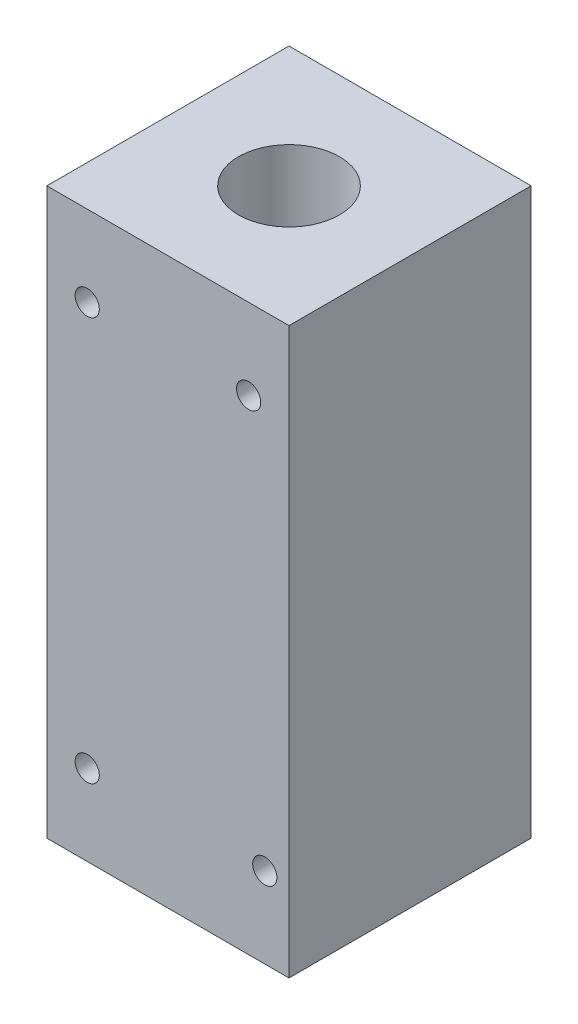
ISO-10303-21;
HEADER;
FILE_DESCRIPTION(('STEP AP214'),'2;1');
FILE_NAME('part.step','',(''),(''),'','','');
FILE_SCHEMA(('AUTOMOTIVE_DESIGN { 1 0 10303 214 1 1 1 1 }'));
ENDSEC;
DATA;
#1=APPLICATION_CONTEXT('core data for automotive mechanical design processes');
#2=APPLICATION_PROTOCOL_DEFINITION('international standard','automotive_design',2000,#1);
#3=PRODUCT_CONTEXT('',#1,'mechanical');
#4=PRODUCT('Part','Part','',(#3));
#5=PRODUCT_RELATED_PRODUCT_CATEGORY('part','',(#4));
#6=PRODUCT_DEFINITION_FORMATION('','',#4);
#7=PRODUCT_DEFINITION_CONTEXT('part definition',#1,'design');
#8=PRODUCT_DEFINITION('design','',#6,#7);
#9=PRODUCT_DEFINITION_SHAPE('','',#8);
#10=(LENGTH_UNIT() NAMED_UNIT(*) SI_UNIT(.MILLI.,.METRE.));
#11=(NAMED_UNIT(*) PLANE_ANGLE_UNIT() SI_UNIT($,.RADIAN.));
#12=(NAMED_UNIT(*) SI_UNIT($,.STERADIAN.) SOLID_ANGLE_UNIT());
#13=UNCERTAINTY_MEASURE_WITH_UNIT(LENGTH_MEASURE(1.E-05),#10,'distance_accuracy_value','');
#14=(GEOMETRIC_REPRESENTATION_CONTEXT(3) GLOBAL_UNCERTAINTY_ASSIGNED_CONTEXT((#13)) GLOBAL_UNIT_ASSIGNED_CONTEXT((#10,
#11,#12)) REPRESENTATION_CONTEXT('',''));
#15=CARTESIAN_POINT('',(0.,0.,0.));
#16=DIRECTION('',(0.,0.,1.));
#17=DIRECTION('',(1.,0.,0.));
#18=AXIS2_PLACEMENT_3D('',#15,#16,#17);
#19=CARTESIAN_POINT('',(0.,0.,30.));
#20=DIRECTION('',(-1.,0.,0.));
#21=DIRECTION('',(0.,0.,1.));
#22=AXIS2_PLACEMENT_3D('',#19,#20,#21);
#23=PLANE('',#22);
#24=DIRECTION('',(0.,1.,0.));
#25=VECTOR('',#24,1.);
#26=CARTESIAN_POINT('',(0.,0.,0.));
#27=LINE('',#26,#25);
#28=CARTESIAN_POINT('',(0.,0.,0.));
#29=VERTEX_POINT('',#28);
#30=CARTESIAN_POINT('',(0.,70.,0.));
#31=VERTEX_POINT('',#30);
#32=EDGE_CURVE('E113',#29,#31,#27,.T.);
#33=ORIENTED_EDGE('',*,*,#32,.T.);
#34=DIRECTION('',(0.,0.,-1.));
#35=VECTOR('',#34,1.);
#36=CARTESIAN_POINT('',(0.,70.,30.));
#37=LINE('',#36,#35);
#38=CARTESIAN_POINT('',(0.,70.,30.));
#39=VERTEX_POINT('',#38);
#40=EDGE_CURVE('E11',#39,#31,#37,.T.);
#41=ORIENTED_EDGE('',*,*,#40,.F.);
#42=DIRECTION('',(0.,1.,0.));
#43=VECTOR('',#42,1.);
#44=CARTESIAN_POINT('',(0.,0.,30.));
#45=LINE('',#44,#43);
#46=CARTESIAN_POINT('',(0.,0.,30.));
#47=VERTEX_POINT('',#46);
#48=EDGE_CURVE('E97',#47,#39,#45,.T.);
#49=ORIENTED_EDGE('',*,*,#48,.F.);
#50=DIRECTION('',(0.,0.,-1.));
#51=VECTOR('',#50,1.);
#52=CARTESIAN_POINT('',(0.,0.,30.));
#53=LINE('',#52,#51);
#54=EDGE_CURVE('E109',#47,#29,#53,.T.);
#55=ORIENTED_EDGE('',*,*,#54,.T.);
#56=EDGE_LOOP('',(#33,#41,#49,#55));
#57=FACE_BOUND('',#56,.T.);
#58=ADVANCED_FACE('F45',(#57),#23,.F.);
#59=CARTESIAN_POINT('',(0.,70.,30.));
#60=DIRECTION('',(0.,-1.,0.));
#61=DIRECTION('',(0.,0.,-1.));
#62=AXIS2_PLACEMENT_3D('',#59,#60,#61);
#63=PLANE('',#62);
#64=CARTESIAN_POINT('',(-15.,70.,15.));
#65=DIRECTION('',(0.,1.,0.));
#66=DIRECTION('',(0.,0.,1.));
#67=AXIS2_PLACEMENT_3D('',#64,#65,#66);
#68=CIRCLE('',#67,6.255);
#69=CARTESIAN_POINT('',(-15.,70.,21.255));
#70=VERTEX_POINT('',#69);
#71=EDGE_CURVE('E134',#70,#70,#68,.T.);
#72=ORIENTED_EDGE('',*,*,#71,.F.);
#73=EDGE_LOOP('',(#72));
#74=FACE_BOUND('',#73,.T.);
#75=DIRECTION('',(-1.,0.,0.));
#76=VECTOR('',#75,1.);
#77=CARTESIAN_POINT('',(0.,70.,0.));
#78=LINE('',#77,#76);
#79=CARTESIAN_POINT('',(-30.,70.,0.));
#80=VERTEX_POINT('',#79);
#81=EDGE_CURVE('E102',#31,#80,#78,.T.);
#82=ORIENTED_EDGE('',*,*,#81,.T.);
#83=DIRECTION('',(0.,0.,-1.));
#84=VECTOR('',#83,1.);
#85=CARTESIAN_POINT('',(-30.,70.,30.));
#86=LINE('',#85,#84);
#87=CARTESIAN_POINT('',(-30.,70.,30.));
#88=VERTEX_POINT('',#87);
#89=EDGE_CURVE('E54',#88,#80,#86,.T.);
#90=ORIENTED_EDGE('',*,*,#89,.F.);
#91=DIRECTION('',(-1.,0.,0.));
#92=VECTOR('',#91,1.);
#93=CARTESIAN_POINT('',(0.,70.,30.));
#94=LINE('',#93,#92);
#95=EDGE_CURVE('E92',#39,#88,#94,.T.);
#96=ORIENTED_EDGE('',*,*,#95,.F.);
#97=ORIENTED_EDGE('',*,*,#40,.T.);
#98=EDGE_LOOP('',(#82,#90,#96,#97));
#99=FACE_BOUND('',#98,.T.);
#100=ADVANCED_FACE('F101',(#74,#99),#63,.F.);
#101=CARTESIAN_POINT('',(-30.,0.,30.));
#102=DIRECTION('',(1.,0.,0.));
#103=DIRECTION('',(0.,0.,-1.));
#104=AXIS2_PLACEMENT_3D('',#101,#102,#103);
#105=PLANE('',#104);
#106=CARTESIAN_POINT('',(-30.,50.,2.92447950342686));
#107=DIRECTION('',(-1.,0.,0.));
#108=DIRECTION('',(0.,0.,1.));
#109=AXIS2_PLACEMENT_3D('',#106,#107,#108);
#110=CIRCLE('',#109,1.5);
#111=CARTESIAN_POINT('',(-30.,50.,4.42447950342686));
#112=VERTEX_POINT('',#111);
#113=EDGE_CURVE('E182',#112,#112,#110,.T.);
#114=ORIENTED_EDGE('',*,*,#113,.F.);
#115=EDGE_LOOP('',(#114));
#116=FACE_BOUND('',#115,.T.);
#117=CARTESIAN_POINT('',(-30.,20.,2.92447950342686));
#118=DIRECTION('',(-1.,0.,0.));
#119=DIRECTION('',(0.,0.,1.));
#120=AXIS2_PLACEMENT_3D('',#117,#118,#119);
#121=CIRCLE('',#120,1.5);
#122=CARTESIAN_POINT('',(-30.,20.,4.42447950342686));
#123=VERTEX_POINT('',#122);
#124=EDGE_CURVE('E178',#123,#123,#121,.T.);
#125=ORIENTED_EDGE('',*,*,#124,.F.);
#126=EDGE_LOOP('',(#125));
#127=FACE_BOUND('',#126,.T.);
#128=DIRECTION('',(0.,-1.,0.));
#129=VECTOR('',#128,1.);
#130=CARTESIAN_POINT('',(-30.,0.,0.));
#131=LINE('',#130,#129);
#132=CARTESIAN_POINT('',(-30.,0.,0.));
#133=VERTEX_POINT('',#132);
#134=EDGE_CURVE('E79',#80,#133,#131,.T.);
#135=ORIENTED_EDGE('',*,*,#134,.T.);
#136=DIRECTION('',(0.,0.,-1.));
#137=VECTOR('',#136,1.);
#138=CARTESIAN_POINT('',(-30.,0.,30.));
#139=LINE('',#138,#137);
#140=CARTESIAN_POINT('',(-30.,0.,30.));
#141=VERTEX_POINT('',#140);
#142=EDGE_CURVE('E104',#141,#133,#139,.T.);
#143=ORIENTED_EDGE('',*,*,#142,.F.);
#144=DIRECTION('',(0.,-1.,0.));
#145=VECTOR('',#144,1.);
#146=CARTESIAN_POINT('',(-30.,0.,30.));
#147=LINE('',#146,#145);
#148=EDGE_CURVE('E95',#88,#141,#147,.T.);
#149=ORIENTED_EDGE('',*,*,#148,.F.);
#150=ORIENTED_EDGE('',*,*,#89,.T.);
#151=EDGE_LOOP('',(#135,#143,#149,#150));
#152=FACE_BOUND('',#151,.T.);
#153=ADVANCED_FACE('F105',(#116,#127,#152),#105,.F.);
#154=CARTESIAN_POINT('',(0.,0.,30.));
#155=DIRECTION('',(0.,1.,0.));
#156=DIRECTION('',(-1.,0.,0.));
#157=AXIS2_PLACEMENT_3D('',#154,#155,#156);
#158=PLANE('',#157);
#159=CARTESIAN_POINT('',(-15.,0.,15.));
#160=DIRECTION('',(0.,1.,0.));
#161=DIRECTION('',(0.,0.,1.));
#162=AXIS2_PLACEMENT_3D('',#159,#160,#161);
#163=CIRCLE('',#162,6.255);
#164=CARTESIAN_POINT('',(-15.,0.,21.255));
#165=VERTEX_POINT('',#164);
#166=EDGE_CURVE('E117',#165,#165,#163,.T.);
#167=ORIENTED_EDGE('',*,*,#166,.T.);
#168=EDGE_LOOP('',(#167));
#169=FACE_BOUND('',#168,.T.);
#170=DIRECTION('',(1.,0.,0.));
#171=VECTOR('',#170,1.);
#172=CARTESIAN_POINT('',(0.,0.,0.));
#173=LINE('',#172,#171);
#174=EDGE_CURVE('E85',#133,#29,#173,.T.);
#175=ORIENTED_EDGE('',*,*,#174,.T.);
#176=ORIENTED_EDGE('',*,*,#54,.F.);
#177=DIRECTION('',(1.,0.,0.));
#178=VECTOR('',#177,1.);
#179=CARTESIAN_POINT('',(0.,0.,30.));
#180=LINE('',#179,#178);
#181=EDGE_CURVE('E62',#141,#47,#180,.T.);
#182=ORIENTED_EDGE('',*,*,#181,.F.);
#183=ORIENTED_EDGE('',*,*,#142,.T.);
#184=EDGE_LOOP('',(#175,#176,#182,#183));
#185=FACE_BOUND('',#184,.T.);
#186=ADVANCED_FACE('F127',(#169,#185),#158,.F.);
#187=CARTESIAN_POINT('',(0.,0.,30.));
#188=DIRECTION('',(0.,0.,1.));
#189=DIRECTION('',(1.,0.,0.));
#190=AXIS2_PLACEMENT_3D('',#187,#188,#189);
#191=PLANE('',#190);
#192=CARTESIAN_POINT('',(-3.,10.,30.));
#193=DIRECTION('',(0.,0.,-1.));
#194=DIRECTION('',(-1.,0.,0.));
#195=AXIS2_PLACEMENT_3D('',#192,#193,#194);
#196=CIRCLE('',#195,1.5);
#197=CARTESIAN_POINT('',(-4.5,10.,30.));
#198=VERTEX_POINT('',#197);
#199=EDGE_CURVE('E159',#198,#198,#196,.T.);
#200=ORIENTED_EDGE('',*,*,#199,.T.);
#201=EDGE_LOOP('',(#200));
#202=FACE_BOUND('',#201,.T.);
#203=CARTESIAN_POINT('',(-25.,60.,30.));
#204=DIRECTION('',(0.,0.,-1.));
#205=DIRECTION('',(-1.,0.,0.));
#206=AXIS2_PLACEMENT_3D('',#203,#204,#205);
#207=CIRCLE('',#206,1.5);
#208=CARTESIAN_POINT('',(-26.5,60.,30.));
#209=VERTEX_POINT('',#208);
#210=EDGE_CURVE('E150',#209,#209,#207,.T.);
#211=ORIENTED_EDGE('',*,*,#210,.T.);
#212=EDGE_LOOP('',(#211));
#213=FACE_BOUND('',#212,.T.);
#214=CARTESIAN_POINT('',(-25.,9.99999999999999,30.));
#215=DIRECTION('',(0.,0.,-1.));
#216=DIRECTION('',(-1.,0.,0.));
#217=AXIS2_PLACEMENT_3D('',#214,#215,#216);
#218=CIRCLE('',#217,1.5);
#219=CARTESIAN_POINT('',(-26.5,9.99999999999999,30.));
#220=VERTEX_POINT('',#219);
#221=EDGE_CURVE('E166',#220,#220,#218,.T.);
#222=ORIENTED_EDGE('',*,*,#221,.T.);
#223=EDGE_LOOP('',(#222));
#224=FACE_BOUND('',#223,.T.);
#225=CARTESIAN_POINT('',(-5.,60.,30.));
#226=DIRECTION('',(0.,0.,-1.));
#227=DIRECTION('',(-1.,0.,0.));
#228=AXIS2_PLACEMENT_3D('',#225,#226,#227);
#229=CIRCLE('',#228,1.5);
#230=CARTESIAN_POINT('',(-6.5,60.,30.));
#231=VERTEX_POINT('',#230);
#232=EDGE_CURVE('E138',#231,#231,#229,.T.);
#233=ORIENTED_EDGE('',*,*,#232,.T.);
#234=EDGE_LOOP('',(#233));
#235=FACE_BOUND('',#234,.T.);
#236=ORIENTED_EDGE('',*,*,#48,.T.);
#237=ORIENTED_EDGE('',*,*,#95,.T.);
#238=ORIENTED_EDGE('',*,*,#148,.T.);
#239=ORIENTED_EDGE('',*,*,#181,.T.);
#240=EDGE_LOOP('',(#236,#237,#238,#239));
#241=FACE_BOUND('',#240,.T.);
#242=ADVANCED_FACE('F93',(#202,#213,#224,#235,#241),#191,.T.);
#243=CARTESIAN_POINT('',(0.,0.,0.));
#244=DIRECTION('',(0.,0.,1.));
#245=DIRECTION('',(1.,0.,0.));
#246=AXIS2_PLACEMENT_3D('',#243,#244,#245);
#247=PLANE('',#246);
#248=CARTESIAN_POINT('',(-3.,10.,0.));
#249=DIRECTION('',(0.,0.,-1.));
#250=DIRECTION('',(-1.,0.,0.));
#251=AXIS2_PLACEMENT_3D('',#248,#249,#250);
#252=CIRCLE('',#251,1.5);
#253=CARTESIAN_POINT('',(-4.5,10.,0.));
#254=VERTEX_POINT('',#253);
#255=EDGE_CURVE('E146',#254,#254,#252,.T.);
#256=ORIENTED_EDGE('',*,*,#255,.F.);
#257=EDGE_LOOP('',(#256));
#258=FACE_BOUND('',#257,.T.);
#259=CARTESIAN_POINT('',(-25.,60.,0.));
#260=DIRECTION('',(0.,0.,-1.));
#261=DIRECTION('',(-1.,0.,0.));
#262=AXIS2_PLACEMENT_3D('',#259,#260,#261);
#263=CIRCLE('',#262,1.5);
#264=CARTESIAN_POINT('',(-26.5,60.,0.));
#265=VERTEX_POINT('',#264);
#266=EDGE_CURVE('E154',#265,#265,#263,.T.);
#267=ORIENTED_EDGE('',*,*,#266,.F.);
#268=EDGE_LOOP('',(#267));
#269=FACE_BOUND('',#268,.T.);
#270=CARTESIAN_POINT('',(-25.,9.99999999999999,0.));
#271=DIRECTION('',(0.,0.,-1.));
#272=DIRECTION('',(-1.,0.,0.));
#273=AXIS2_PLACEMENT_3D('',#270,#271,#272);
#274=CIRCLE('',#273,1.5);
#275=CARTESIAN_POINT('',(-26.5,9.99999999999999,0.));
#276=VERTEX_POINT('',#275);
#277=EDGE_CURVE('E155',#276,#276,#274,.T.);
#278=ORIENTED_EDGE('',*,*,#277,.F.);
#279=EDGE_LOOP('',(#278));
#280=FACE_BOUND('',#279,.T.);
#281=CARTESIAN_POINT('',(-5.,60.,0.));
#282=DIRECTION('',(0.,0.,-1.));
#283=DIRECTION('',(-1.,0.,0.));
#284=AXIS2_PLACEMENT_3D('',#281,#282,#283);
#285=CIRCLE('',#284,1.5);
#286=CARTESIAN_POINT('',(-6.5,60.,0.));
#287=VERTEX_POINT('',#286);
#288=EDGE_CURVE('E142',#287,#287,#285,.T.);
#289=ORIENTED_EDGE('',*,*,#288,.F.);
#290=EDGE_LOOP('',(#289));
#291=FACE_BOUND('',#290,.T.);
#292=ORIENTED_EDGE('',*,*,#32,.F.);
#293=ORIENTED_EDGE('',*,*,#174,.F.);
#294=ORIENTED_EDGE('',*,*,#134,.F.);
#295=ORIENTED_EDGE('',*,*,#81,.F.);
#296=EDGE_LOOP('',(#292,#293,#294,#295));
#297=FACE_BOUND('',#296,.T.);
#298=ADVANCED_FACE('F130',(#258,#269,#280,#291,#297),#247,.F.);
#299=CARTESIAN_POINT('',(-15.,0.,15.));
#300=DIRECTION('',(0.,1.,0.));
#301=DIRECTION('',(0.,0.,1.));
#302=AXIS2_PLACEMENT_3D('',#299,#300,#301);
#303=CYLINDRICAL_SURFACE('',#302,6.255);
#304=ORIENTED_EDGE('',*,*,#166,.F.);
#305=EDGE_LOOP('',(#304));
#306=FACE_BOUND('',#305,.T.);
#307=ORIENTED_EDGE('',*,*,#71,.T.);
#308=EDGE_LOOP('',(#307));
#309=FACE_BOUND('',#308,.T.);
#310=ADVANCED_FACE('F233',(#306,#309),#303,.F.);
#311=CARTESIAN_POINT('',(-5.,60.,30.));
#312=DIRECTION('',(0.,0.,-1.));
#313=DIRECTION('',(-1.,0.,0.));
#314=AXIS2_PLACEMENT_3D('',#311,#312,#313);
#315=CYLINDRICAL_SURFACE('',#314,1.5);
#316=ORIENTED_EDGE('',*,*,#232,.F.);
#317=EDGE_LOOP('',(#316));
#318=FACE_BOUND('',#317,.T.);
#319=ORIENTED_EDGE('',*,*,#288,.T.);
#320=EDGE_LOOP('',(#319));
#321=FACE_BOUND('',#320,.T.);
#322=ADVANCED_FACE('F240',(#318,#321),#315,.F.);
#323=CARTESIAN_POINT('',(-25.,9.99999999999999,30.));
#324=DIRECTION('',(0.,0.,-1.));
#325=DIRECTION('',(-1.,0.,0.));
#326=AXIS2_PLACEMENT_3D('',#323,#324,#325);
#327=CYLINDRICAL_SURFACE('',#326,1.5);
#328=ORIENTED_EDGE('',*,*,#221,.F.);
#329=EDGE_LOOP('',(#328));
#330=FACE_BOUND('',#329,.T.);
#331=ORIENTED_EDGE('',*,*,#277,.T.);
#332=EDGE_LOOP('',(#331));
#333=FACE_BOUND('',#332,.T.);
#334=ADVANCED_FACE('F244',(#330,#333),#327,.F.);
#335=CARTESIAN_POINT('',(-25.,60.,30.));
#336=DIRECTION('',(0.,0.,-1.));
#337=DIRECTION('',(-1.,0.,0.));
#338=AXIS2_PLACEMENT_3D('',#335,#336,#337);
#339=CYLINDRICAL_SURFACE('',#338,1.5);
#340=ORIENTED_EDGE('',*,*,#210,.F.);
#341=EDGE_LOOP('',(#340));
#342=FACE_BOUND('',#341,.T.);
#343=ORIENTED_EDGE('',*,*,#266,.T.);
#344=EDGE_LOOP('',(#343));
#345=FACE_BOUND('',#344,.T.);
#346=ADVANCED_FACE('F215',(#342,#345),#339,.F.);
#347=CARTESIAN_POINT('',(-3.,10.,30.));
#348=DIRECTION('',(0.,0.,-1.));
#349=DIRECTION('',(-1.,0.,0.));
#350=AXIS2_PLACEMENT_3D('',#347,#348,#349);
#351=CYLINDRICAL_SURFACE('',#350,1.5);
#352=ORIENTED_EDGE('',*,*,#199,.F.);
#353=EDGE_LOOP('',(#352));
#354=FACE_BOUND('',#353,.T.);
#355=ORIENTED_EDGE('',*,*,#255,.T.);
#356=EDGE_LOOP('',(#355));
#357=FACE_BOUND('',#356,.T.);
#358=ADVANCED_FACE('F206',(#354,#357),#351,.F.);
#359=CARTESIAN_POINT('',(-20.,20.,2.92447950342686));
#360=DIRECTION('',(-1.,0.,0.));
#361=DIRECTION('',(0.,0.,1.));
#362=AXIS2_PLACEMENT_3D('',#359,#360,#361);
#363=CYLINDRICAL_SURFACE('',#362,1.5);
#364=CARTESIAN_POINT('',(-20.,20.,2.92447950342686));
#365=DIRECTION('',(-1.,0.,0.));
#366=DIRECTION('',(0.,0.,1.));
#367=AXIS2_PLACEMENT_3D('',#364,#365,#366);
#368=CIRCLE('',#367,1.5);
#369=CARTESIAN_POINT('',(-20.,20.,4.42447950342686));
#370=VERTEX_POINT('',#369);
#371=EDGE_CURVE('E174',#370,#370,#368,.T.);
#372=ORIENTED_EDGE('',*,*,#371,.F.);
#373=EDGE_LOOP('',(#372));
#374=FACE_BOUND('',#373,.T.);
#375=ORIENTED_EDGE('',*,*,#124,.T.);
#376=EDGE_LOOP('',(#375));
#377=FACE_BOUND('',#376,.T.);
#378=ADVANCED_FACE('F204',(#374,#377),#363,.F.);
#379=CARTESIAN_POINT('',(-20.,20.,2.92447950342686));
#380=DIRECTION('',(-1.,0.,0.));
#381=DIRECTION('',(0.,0.,1.));
#382=AXIS2_PLACEMENT_3D('',#379,#380,#381);
#383=PLANE('',#382);
#384=ORIENTED_EDGE('',*,*,#371,.T.);
#385=EDGE_LOOP('',(#384));
#386=FACE_BOUND('',#385,.T.);
#387=ADVANCED_FACE('F195',(#386),#383,.T.);
#388=CARTESIAN_POINT('',(-20.,50.,2.92447950342686));
#389=DIRECTION('',(-1.,0.,0.));
#390=DIRECTION('',(0.,0.,1.));
#391=AXIS2_PLACEMENT_3D('',#388,#389,#390);
#392=CYLINDRICAL_SURFACE('',#391,1.5);
#393=CARTESIAN_POINT('',(-20.,50.,2.92447950342686));
#394=DIRECTION('',(-1.,0.,0.));
#395=DIRECTION('',(0.,0.,1.));
#396=AXIS2_PLACEMENT_3D('',#393,#394,#395);
#397=CIRCLE('',#396,1.5);
#398=CARTESIAN_POINT('',(-20.,50.,4.42447950342686));
#399=VERTEX_POINT('',#398);
#400=EDGE_CURVE('E170',#399,#399,#397,.T.);
#401=ORIENTED_EDGE('',*,*,#400,.F.);
#402=EDGE_LOOP('',(#401));
#403=FACE_BOUND('',#402,.T.);
#404=ORIENTED_EDGE('',*,*,#113,.T.);
#405=EDGE_LOOP('',(#404));
#406=FACE_BOUND('',#405,.T.);
#407=ADVANCED_FACE('F192',(#403,#406),#392,.F.);
#408=CARTESIAN_POINT('',(-20.,50.,2.92447950342686));
#409=DIRECTION('',(-1.,0.,0.));
#410=DIRECTION('',(0.,0.,1.));
#411=AXIS2_PLACEMENT_3D('',#408,#409,#410);
#412=PLANE('',#411);
#413=ORIENTED_EDGE('',*,*,#400,.T.);
#414=EDGE_LOOP('',(#413));
#415=FACE_BOUND('',#414,.T.);
#416=ADVANCED_FACE('F190',(#415),#412,.T.);
#417=CLOSED_SHELL('',(#58,#100,#153,#186,#242,#298,#310,#322,#334,#346,#358,#378,#387,#407,#416));
#418=MANIFOLD_SOLID_BREP('B2',#417);
#419=ADVANCED_BREP_SHAPE_REPRESENTATION('',(#18,#418),#14);
#420=SHAPE_DEFINITION_REPRESENTATION(#9,#419);
ENDSEC;
END-ISO-10303-21;
